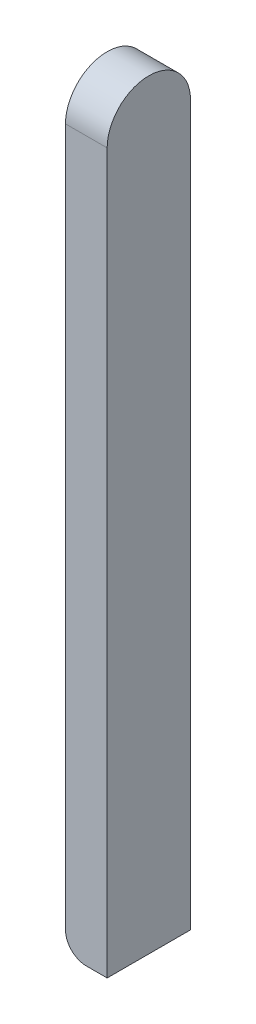
ISO-10303-21;
HEADER;
FILE_DESCRIPTION(('STEP AP214'),'2;1');
FILE_NAME('part.step','',(''),(''),'','','');
FILE_SCHEMA(('AUTOMOTIVE_DESIGN { 1 0 10303 214 1 1 1 1 }'));
ENDSEC;
DATA;
#1=APPLICATION_CONTEXT('core data for automotive mechanical design processes');
#2=APPLICATION_PROTOCOL_DEFINITION('international standard','automotive_design',2000,#1);
#3=PRODUCT_CONTEXT('',#1,'mechanical');
#4=PRODUCT('Part','Part','',(#3));
#5=PRODUCT_RELATED_PRODUCT_CATEGORY('part','',(#4));
#6=PRODUCT_DEFINITION_FORMATION('','',#4);
#7=PRODUCT_DEFINITION_CONTEXT('part definition',#1,'design');
#8=PRODUCT_DEFINITION('design','',#6,#7);
#9=PRODUCT_DEFINITION_SHAPE('','',#8);
#10=(LENGTH_UNIT() NAMED_UNIT(*) SI_UNIT(.MILLI.,.METRE.));
#11=(NAMED_UNIT(*) PLANE_ANGLE_UNIT() SI_UNIT($,.RADIAN.));
#12=(NAMED_UNIT(*) SI_UNIT($,.STERADIAN.) SOLID_ANGLE_UNIT());
#13=UNCERTAINTY_MEASURE_WITH_UNIT(LENGTH_MEASURE(1.E-05),#10,'distance_accuracy_value','');
#14=(GEOMETRIC_REPRESENTATION_CONTEXT(3) GLOBAL_UNCERTAINTY_ASSIGNED_CONTEXT((#13)) GLOBAL_UNIT_ASSIGNED_CONTEXT((#10,
#11,#12)) REPRESENTATION_CONTEXT('',''));
#15=CARTESIAN_POINT('',(0.,0.,0.));
#16=DIRECTION('',(0.,0.,1.));
#17=DIRECTION('',(1.,0.,0.));
#18=AXIS2_PLACEMENT_3D('',#15,#16,#17);
#19=CARTESIAN_POINT('',(1.,8.125,0.));
#20=DIRECTION('',(-1.,0.,0.));
#21=DIRECTION('',(0.,0.,1.));
#22=AXIS2_PLACEMENT_3D('',#19,#20,#21);
#23=CYLINDRICAL_SURFACE('',#22,1.);
#24=CARTESIAN_POINT('',(0.,8.125,0.));
#25=DIRECTION('',(1.,0.,0.));
#26=DIRECTION('',(0.,0.,1.));
#27=AXIS2_PLACEMENT_3D('',#24,#25,#26);
#28=CIRCLE('',#27,1.);
#29=CARTESIAN_POINT('',(0.,8.125,-0.999999999999997));
#30=VERTEX_POINT('',#29);
#31=CARTESIAN_POINT('',(0.,8.125,1.));
#32=VERTEX_POINT('',#31);
#33=EDGE_CURVE('E104',#30,#32,#28,.T.);
#34=ORIENTED_EDGE('',*,*,#33,.T.);
#35=DIRECTION('',(-1.,0.,0.));
#36=VECTOR('',#35,1.);
#37=CARTESIAN_POINT('',(1.,8.125,1.));
#38=LINE('',#37,#36);
#39=CARTESIAN_POINT('',(1.,8.125,1.));
#40=VERTEX_POINT('',#39);
#41=EDGE_CURVE('E85',#40,#32,#38,.T.);
#42=ORIENTED_EDGE('',*,*,#41,.F.);
#43=CARTESIAN_POINT('',(1.,8.125,0.));
#44=DIRECTION('',(1.,0.,0.));
#45=DIRECTION('',(0.,0.,1.));
#46=AXIS2_PLACEMENT_3D('',#43,#44,#45);
#47=CIRCLE('',#46,1.);
#48=CARTESIAN_POINT('',(1.,8.125,-0.999999999999997));
#49=VERTEX_POINT('',#48);
#50=EDGE_CURVE('E92',#49,#40,#47,.T.);
#51=ORIENTED_EDGE('',*,*,#50,.F.);
#52=DIRECTION('',(-1.,0.,0.));
#53=VECTOR('',#52,1.);
#54=CARTESIAN_POINT('',(1.,8.125,-0.999999999999997));
#55=LINE('',#54,#53);
#56=EDGE_CURVE('E114',#49,#30,#55,.T.);
#57=ORIENTED_EDGE('',*,*,#56,.T.);
#58=EDGE_LOOP('',(#34,#42,#51,#57));
#59=FACE_BOUND('',#58,.T.);
#60=ADVANCED_FACE('F36',(#59),#23,.T.);
#61=CARTESIAN_POINT('',(1.,8.125,1.));
#62=DIRECTION('',(0.,0.,-1.));
#63=DIRECTION('',(0.,1.,0.));
#64=AXIS2_PLACEMENT_3D('',#61,#62,#63);
#65=PLANE('',#64);
#66=DIRECTION('',(0.,-1.,0.));
#67=VECTOR('',#66,1.);
#68=CARTESIAN_POINT('',(0.,8.125,1.));
#69=LINE('',#68,#67);
#70=CARTESIAN_POINT('',(0.,-8.625,1.));
#71=VERTEX_POINT('',#70);
#72=EDGE_CURVE('E117',#32,#71,#69,.T.);
#73=ORIENTED_EDGE('',*,*,#72,.T.);
#74=CARTESIAN_POINT('',(0.5,-8.625,1.));
#75=DIRECTION('',(0.,0.,-1.));
#76=DIRECTION('',(0.,1.,0.));
#77=AXIS2_PLACEMENT_3D('',#74,#75,#76);
#78=CIRCLE('',#77,0.5);
#79=CARTESIAN_POINT('',(0.5,-9.125,1.));
#80=VERTEX_POINT('',#79);
#81=EDGE_CURVE('E11',#71,#80,#78,.F.);
#82=ORIENTED_EDGE('',*,*,#81,.T.);
#83=DIRECTION('',(-1.,0.,0.));
#84=VECTOR('',#83,1.);
#85=CARTESIAN_POINT('',(1.,-9.125,1.));
#86=LINE('',#85,#84);
#87=CARTESIAN_POINT('',(1.,-9.125,1.));
#88=VERTEX_POINT('',#87);
#89=EDGE_CURVE('E88',#88,#80,#86,.T.);
#90=ORIENTED_EDGE('',*,*,#89,.F.);
#91=DIRECTION('',(0.,-1.,0.));
#92=VECTOR('',#91,1.);
#93=CARTESIAN_POINT('',(1.,8.125,1.));
#94=LINE('',#93,#92);
#95=EDGE_CURVE('E81',#40,#88,#94,.T.);
#96=ORIENTED_EDGE('',*,*,#95,.F.);
#97=ORIENTED_EDGE('',*,*,#41,.T.);
#98=EDGE_LOOP('',(#73,#82,#90,#96,#97));
#99=FACE_BOUND('',#98,.T.);
#100=ADVANCED_FACE('F83',(#99),#65,.F.);
#101=CARTESIAN_POINT('',(1.,-9.125,1.));
#102=DIRECTION('',(0.,1.,0.));
#103=DIRECTION('',(0.,0.,1.));
#104=AXIS2_PLACEMENT_3D('',#101,#102,#103);
#105=PLANE('',#104);
#106=ORIENTED_EDGE('',*,*,#89,.T.);
#107=DIRECTION('',(0.,0.,-1.));
#108=VECTOR('',#107,1.);
#109=CARTESIAN_POINT('',(0.5,-9.125,-1.));
#110=LINE('',#109,#108);
#111=CARTESIAN_POINT('',(0.5,-9.125,-1.));
#112=VERTEX_POINT('',#111);
#113=EDGE_CURVE('E105',#80,#112,#110,.T.);
#114=ORIENTED_EDGE('',*,*,#113,.T.);
#115=DIRECTION('',(-1.,0.,0.));
#116=VECTOR('',#115,1.);
#117=CARTESIAN_POINT('',(1.,-9.125,-1.));
#118=LINE('',#117,#116);
#119=CARTESIAN_POINT('',(1.,-9.125,-1.));
#120=VERTEX_POINT('',#119);
#121=EDGE_CURVE('E109',#120,#112,#118,.T.);
#122=ORIENTED_EDGE('',*,*,#121,.F.);
#123=DIRECTION('',(0.,0.,-1.));
#124=VECTOR('',#123,1.);
#125=CARTESIAN_POINT('',(1.,-9.125,1.));
#126=LINE('',#125,#124);
#127=EDGE_CURVE('E91',#88,#120,#126,.T.);
#128=ORIENTED_EDGE('',*,*,#127,.F.);
#129=EDGE_LOOP('',(#106,#114,#122,#128));
#130=FACE_BOUND('',#129,.T.);
#131=ADVANCED_FACE('F123',(#130),#105,.F.);
#132=CARTESIAN_POINT('',(1.,8.125,-0.999999999999997));
#133=DIRECTION('',(0.,0.,1.));
#134=DIRECTION('',(0.,-1.,0.));
#135=AXIS2_PLACEMENT_3D('',#132,#133,#134);
#136=PLANE('',#135);
#137=ORIENTED_EDGE('',*,*,#121,.T.);
#138=CARTESIAN_POINT('',(0.5,-8.625,-1.));
#139=DIRECTION('',(0.,0.,1.));
#140=DIRECTION('',(0.,-1.,0.));
#141=AXIS2_PLACEMENT_3D('',#138,#139,#140);
#142=CIRCLE('',#141,0.5);
#143=CARTESIAN_POINT('',(0.,-8.625,-1.));
#144=VERTEX_POINT('',#143);
#145=EDGE_CURVE('E58',#112,#144,#142,.F.);
#146=ORIENTED_EDGE('',*,*,#145,.T.);
#147=DIRECTION('',(0.,1.,0.));
#148=VECTOR('',#147,1.);
#149=CARTESIAN_POINT('',(0.,8.125,-0.999999999999997));
#150=LINE('',#149,#148);
#151=EDGE_CURVE('E101',#144,#30,#150,.T.);
#152=ORIENTED_EDGE('',*,*,#151,.T.);
#153=ORIENTED_EDGE('',*,*,#56,.F.);
#154=DIRECTION('',(0.,1.,0.));
#155=VECTOR('',#154,1.);
#156=CARTESIAN_POINT('',(1.,8.125,-0.999999999999997));
#157=LINE('',#156,#155);
#158=EDGE_CURVE('E97',#120,#49,#157,.T.);
#159=ORIENTED_EDGE('',*,*,#158,.F.);
#160=EDGE_LOOP('',(#137,#146,#152,#153,#159));
#161=FACE_BOUND('',#160,.T.);
#162=ADVANCED_FACE('F125',(#161),#136,.F.);
#163=CARTESIAN_POINT('',(1.,8.125,0.));
#164=DIRECTION('',(-1.,0.,0.));
#165=DIRECTION('',(0.,0.,1.));
#166=AXIS2_PLACEMENT_3D('',#163,#164,#165);
#167=PLANE('',#166);
#168=ORIENTED_EDGE('',*,*,#50,.T.);
#169=ORIENTED_EDGE('',*,*,#95,.T.);
#170=ORIENTED_EDGE('',*,*,#127,.T.);
#171=ORIENTED_EDGE('',*,*,#158,.T.);
#172=EDGE_LOOP('',(#168,#169,#170,#171));
#173=FACE_BOUND('',#172,.T.);
#174=ADVANCED_FACE('F95',(#173),#167,.F.);
#175=CARTESIAN_POINT('',(0.,8.125,0.));
#176=DIRECTION('',(-1.,0.,0.));
#177=DIRECTION('',(0.,0.,1.));
#178=AXIS2_PLACEMENT_3D('',#175,#176,#177);
#179=PLANE('',#178);
#180=ORIENTED_EDGE('',*,*,#151,.F.);
#181=DIRECTION('',(0.,0.,-1.));
#182=VECTOR('',#181,1.);
#183=CARTESIAN_POINT('',(0.,-8.625,1.));
#184=LINE('',#183,#182);
#185=EDGE_CURVE('E44',#144,#71,#184,.F.);
#186=ORIENTED_EDGE('',*,*,#185,.T.);
#187=ORIENTED_EDGE('',*,*,#72,.F.);
#188=ORIENTED_EDGE('',*,*,#33,.F.);
#189=EDGE_LOOP('',(#180,#186,#187,#188));
#190=FACE_BOUND('',#189,.T.);
#191=ADVANCED_FACE('F126',(#190),#179,.T.);
#192=CARTESIAN_POINT('',(0.5,-8.625,1.));
#193=DIRECTION('',(0.,0.,1.));
#194=DIRECTION('',(1.,0.,0.));
#195=AXIS2_PLACEMENT_3D('',#192,#193,#194);
#196=CYLINDRICAL_SURFACE('',#195,0.5);
#197=ORIENTED_EDGE('',*,*,#81,.F.);
#198=ORIENTED_EDGE('',*,*,#185,.F.);
#199=ORIENTED_EDGE('',*,*,#145,.F.);
#200=ORIENTED_EDGE('',*,*,#113,.F.);
#201=EDGE_LOOP('',(#197,#198,#199,#200));
#202=FACE_BOUND('',#201,.T.);
#203=ADVANCED_FACE('F38',(#202),#196,.T.);
#204=CLOSED_SHELL('',(#60,#100,#131,#162,#174,#191,#203));
#205=MANIFOLD_SOLID_BREP('B2',#204);
#206=ADVANCED_BREP_SHAPE_REPRESENTATION('',(#18,#205),#14);
#207=SHAPE_DEFINITION_REPRESENTATION(#9,#206);
ENDSEC;
END-ISO-10303-21;
